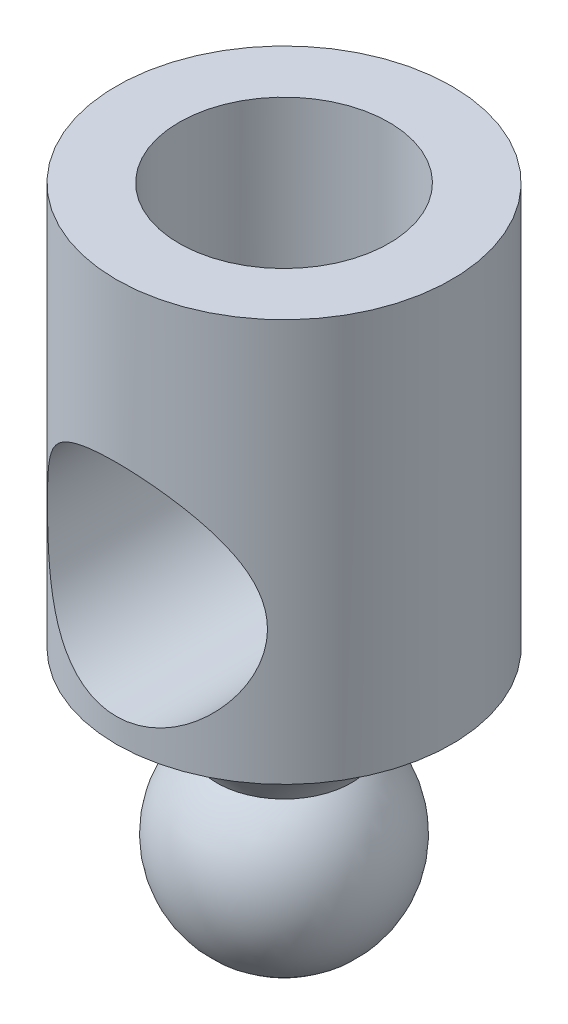
ISO-10303-21;
HEADER;
FILE_DESCRIPTION(('STEP AP214'),'2;1');
FILE_NAME('part.step','',(''),(''),'','','');
FILE_SCHEMA(('AUTOMOTIVE_DESIGN { 1 0 10303 214 1 1 1 1 }'));
ENDSEC;
DATA;
#1=APPLICATION_CONTEXT('core data for automotive mechanical design processes');
#2=APPLICATION_PROTOCOL_DEFINITION('international standard','automotive_design',2000,#1);
#3=PRODUCT_CONTEXT('',#1,'mechanical');
#4=PRODUCT('Part','Part','',(#3));
#5=PRODUCT_RELATED_PRODUCT_CATEGORY('part','',(#4));
#6=PRODUCT_DEFINITION_FORMATION('','',#4);
#7=PRODUCT_DEFINITION_CONTEXT('part definition',#1,'design');
#8=PRODUCT_DEFINITION('design','',#6,#7);
#9=PRODUCT_DEFINITION_SHAPE('','',#8);
#10=(LENGTH_UNIT() NAMED_UNIT(*) SI_UNIT(.MILLI.,.METRE.));
#11=(NAMED_UNIT(*) PLANE_ANGLE_UNIT() SI_UNIT($,.RADIAN.));
#12=(NAMED_UNIT(*) SI_UNIT($,.STERADIAN.) SOLID_ANGLE_UNIT());
#13=UNCERTAINTY_MEASURE_WITH_UNIT(LENGTH_MEASURE(1.E-05),#10,'distance_accuracy_value','');
#14=(GEOMETRIC_REPRESENTATION_CONTEXT(3) GLOBAL_UNCERTAINTY_ASSIGNED_CONTEXT((#13)) GLOBAL_UNIT_ASSIGNED_CONTEXT((#10,
#11,#12)) REPRESENTATION_CONTEXT('',''));
#15=CARTESIAN_POINT('',(0.,0.,0.));
#16=DIRECTION('',(0.,0.,1.));
#17=DIRECTION('',(1.,0.,0.));
#18=AXIS2_PLACEMENT_3D('',#15,#16,#17);
#19=CARTESIAN_POINT('',(0.,19.05,6.35));
#20=DIRECTION('',(0.,0.,-1.));
#21=DIRECTION('',(-1.,0.,0.));
#22=AXIS2_PLACEMENT_3D('',#19,#20,#21);
#23=CYLINDRICAL_SURFACE('',#22,4.1656);
#24=CARTESIAN_POINT('',(-3.97510000000001,20.2953125511292,0.));
#25=CARTESIAN_POINT('',(-3.97509554968441,20.295335517422,-0.0791519670148016));
#26=CARTESIAN_POINT('',(-3.97269911174385,20.3030518927231,-0.158429365302658));
#27=CARTESIAN_POINT('',(-3.9634362281013,20.3320317599681,-0.314261230762067));
#28=CARTESIAN_POINT('',(-3.95655215492789,20.3533486678702,-0.390803699161001));
#29=CARTESIAN_POINT('',(-3.9335422580962,20.4216356934315,-0.586068165336453));
#30=CARTESIAN_POINT('',(-3.91433405819917,20.476317896123,-0.701611718517444));
#31=CARTESIAN_POINT('',(-3.8678301117265,20.5980416781041,-0.924303844677984));
#32=CARTESIAN_POINT('',(-3.84049682348175,20.6651400703834,-1.03141046343628));
#33=CARTESIAN_POINT('',(-3.77306328873875,20.8175773146966,-1.25763625925175));
#34=CARTESIAN_POINT('',(-3.73156431376295,20.9040507211393,-1.37556473436991));
#35=CARTESIAN_POINT('',(-3.63874170014305,21.0802101884166,-1.60508440145081));
#36=CARTESIAN_POINT('',(-3.58740789866918,21.169899493788,-1.71666888180309));
#37=CARTESIAN_POINT('',(-3.47487809033465,21.3497170107396,-1.93433052348862));
#38=CARTESIAN_POINT('',(-3.41368457569766,21.4398451058393,-2.04040906761331));
#39=CARTESIAN_POINT('',(-3.2812249139595,21.6186910047624,-2.24723212284271));
#40=CARTESIAN_POINT('',(-3.20996411591336,21.7074095298634,-2.34797942777272));
#41=CARTESIAN_POINT('',(-3.06729332848414,21.8702885256015,-2.5307500094184));
#42=CARTESIAN_POINT('',(-2.99718781438875,21.9448043833894,-2.61347116507935));
#43=CARTESIAN_POINT('',(-2.84898246634603,22.0907820655723,-2.77429025237044));
#44=CARTESIAN_POINT('',(-2.77088168664025,22.1622435272429,-2.8523876353268));
#45=CARTESIAN_POINT('',(-2.52453973459111,22.3703945656682,-3.07859166655701));
#46=CARTESIAN_POINT('',(-2.34388837985462,22.5012872744491,-3.2190944127581));
#47=CARTESIAN_POINT('',(-1.99957313820616,22.7083303830687,-3.44000436779745));
#48=CARTESIAN_POINT('',(-1.84321466785163,22.7899460811214,-3.52661637287176));
#49=CARTESIAN_POINT('',(-1.59589854389924,22.898826373924,-3.64181523435134));
#50=CARTESIAN_POINT('',(-1.51129965757958,22.9328717168974,-3.67777122714025));
#51=CARTESIAN_POINT('',(-1.33817941647003,22.9958805754372,-3.74423315541814));
#52=CARTESIAN_POINT('',(-1.24965982633125,23.0248463487074,-3.77474151231501));
#53=CARTESIAN_POINT('',(-1.06823243462263,23.0774201941247,-3.83006331298163));
#54=CARTESIAN_POINT('',(-0.975289027911774,23.1009704774091,-3.85481535998253));
#55=CARTESIAN_POINT('',(-0.786582665761275,23.1417994187037,-3.89769959846763));
#56=CARTESIAN_POINT('',(-0.690821277694728,23.1590814944103,-3.91583539744633));
#57=CARTESIAN_POINT('',(-0.497325775056433,23.186959981716,-3.94507972904877));
#58=CARTESIAN_POINT('',(-0.399592901564402,23.1975604717852,-3.95619254854196));
#59=CARTESIAN_POINT('',(-0.203075504425245,23.2118128038177,-3.97113176886082));
#60=CARTESIAN_POINT('',(-0.104291152402012,23.2154657627949,-3.97495934099815));
#61=CARTESIAN_POINT('',(0.0787835082985789,23.2157077956055,-3.97521295189046));
#62=CARTESIAN_POINT('',(0.163073232429158,23.2132549123428,-3.97264282716009));
#63=CARTESIAN_POINT('',(0.331028053252356,23.2032802657629,-3.9621882339517));
#64=CARTESIAN_POINT('',(0.414692951212825,23.1957569538192,-3.95430214185399));
#65=CARTESIAN_POINT('',(0.663744277816944,23.1657651182119,-3.92285136056157));
#66=CARTESIAN_POINT('',(0.827363974163283,23.1358745172631,-3.89149400658756));
#67=CARTESIAN_POINT('',(1.14251689143091,23.0590910665919,-3.81079490668587));
#68=CARTESIAN_POINT('',(1.29421074305759,23.0125027207292,-3.76177517593944));
#69=CARTESIAN_POINT('',(1.58620001776711,22.9049218743675,-3.64827974313377));
#70=CARTESIAN_POINT('',(1.72649199770879,22.8439250443525,-3.5837993953219));
#71=CARTESIAN_POINT('',(2.05708902250343,22.6788987998687,-3.40871306455951));
#72=CARTESIAN_POINT('',(2.24006185300177,22.5680918117728,-3.29064495702532));
#73=CARTESIAN_POINT('',(2.57780363893526,22.3287505754322,-3.03342440256924));
#74=CARTESIAN_POINT('',(2.73248772443709,22.2001649516526,-2.8942107312968));
#75=CARTESIAN_POINT('',(2.96784233547187,21.9759524422894,-2.64802726171746));
#76=CARTESIAN_POINT('',(3.05615232944822,21.8833403195651,-2.54544883435078));
#77=CARTESIAN_POINT('',(3.22072064646752,21.6947760609414,-2.33374635564057));
#78=CARTESIAN_POINT('',(3.2969720219562,21.5988220381751,-2.22461858048333));
#79=CARTESIAN_POINT('',(3.43764673182018,21.4056456908191,-2.00037731169355));
#80=CARTESIAN_POINT('',(3.50208463051244,21.3084250883768,-1.88527141609726));
#81=CARTESIAN_POINT('',(3.61949886364601,21.1149927788909,-1.64866810516243));
#82=CARTESIAN_POINT('',(3.67248392402363,21.018780357275,-1.52717564412753));
#83=CARTESIAN_POINT('',(3.75667877123558,20.8517575215906,-1.30374082655202));
#84=CARTESIAN_POINT('',(3.79011604312019,20.7799994845247,-1.20334585299348));
#85=CARTESIAN_POINT('',(3.84977977142544,20.642783296903,-0.996124985511713));
#86=CARTESIAN_POINT('',(3.8760081106929,20.5773235042648,-0.889300779693336));
#87=CARTESIAN_POINT('',(3.91405101478162,20.476348604399,-0.698691452513253));
#88=CARTESIAN_POINT('',(3.92784266869117,20.4376220902311,-0.617046934783287));
#89=CARTESIAN_POINT('',(3.95060132883655,20.3714392917384,-0.448692498154514));
#90=CARTESIAN_POINT('',(3.95958451570897,20.3439452845962,-0.362000669727867));
#91=CARTESIAN_POINT('',(3.97040807963939,20.3102911072829,-0.204852828007871));
#92=CARTESIAN_POINT('',(3.97341609540265,20.3006785788334,-0.135248598780442));
#93=CARTESIAN_POINT('',(3.9757106630138,20.2933697781969,0.00461994589456567));
#94=CARTESIAN_POINT('',(3.97500096452621,20.2956614994348,0.074883524932912));
#95=CARTESIAN_POINT('',(3.96996432727234,20.3116119315152,0.213571848369096));
#96=CARTESIAN_POINT('',(3.96565359418019,20.325219715636,0.282003415919522));
#97=CARTESIAN_POINT('',(3.95382874256199,20.3614176620368,0.416194000167378));
#98=CARTESIAN_POINT('',(3.94630794645034,20.3840265418009,0.481947131073212));
#99=CARTESIAN_POINT('',(3.92807294573094,20.4368226193649,0.61341368749699));
#100=CARTESIAN_POINT('',(3.91722644497505,20.4673134645011,0.678982932788214));
#101=CARTESIAN_POINT('',(3.89282522369571,20.5330289975351,0.807211187783168));
#102=CARTESIAN_POINT('',(3.87926742059461,20.5682590585581,0.869866783995983));
#103=CARTESIAN_POINT('',(3.83475061769184,20.6788588067278,1.05463814932593));
#104=CARTESIAN_POINT('',(3.80002684672926,20.7588931175626,1.17302741137162));
#105=CARTESIAN_POINT('',(3.71651111921415,20.9342524746542,1.41686654646912));
#106=CARTESIAN_POINT('',(3.66651442689719,21.0302476927119,1.54139502086193));
#107=CARTESIAN_POINT('',(3.55493014927542,21.224223600502,1.78372426009792));
#108=CARTESIAN_POINT('',(3.49333162162094,21.3222060860516,1.90151853569409));
#109=CARTESIAN_POINT('',(3.35843379485028,21.5172246927455,2.13072535332603));
#110=CARTESIAN_POINT('',(3.28515038196089,21.6142619116397,2.24214628474038));
#111=CARTESIAN_POINT('',(3.12651541022343,21.8054594347315,2.45851556544607));
#112=CARTESIAN_POINT('',(3.0411715523947,21.8996215284981,2.56346798416657));
#113=CARTESIAN_POINT('',(2.81424278984539,22.1271680667836,2.81464088943341));
#114=CARTESIAN_POINT('',(2.66522598366777,22.2578835142798,2.95672066463515));
#115=CARTESIAN_POINT('',(2.33896018766756,22.5029733677869,3.22096507980157));
#116=CARTESIAN_POINT('',(2.16176262220362,22.617376832343,3.34316519004067));
#117=CARTESIAN_POINT('',(1.82127619129258,22.800176862334,3.53749235754921));
#118=CARTESIAN_POINT('',(1.66343416799955,22.8731624019056,3.61472488312241));
#119=CARTESIAN_POINT('',(1.41535098107087,22.9687865145644,3.7156693486698));
#120=CARTESIAN_POINT('',(1.3307418058832,22.9983592290148,3.74684082691956));
#121=CARTESIAN_POINT('',(1.1581416102002,23.0523861946528,3.80373129653645));
#122=CARTESIAN_POINT('',(1.07015215109963,23.0768427761832,3.8294527703903));
#123=CARTESIAN_POINT('',(0.890505519786361,23.1203614097743,3.87518883265988));
#124=CARTESIAN_POINT('',(0.798822586126504,23.1393732674792,3.89515033243884));
#125=CARTESIAN_POINT('',(0.613281813242719,23.1712816765694,3.92863655181075));
#126=CARTESIAN_POINT('',(0.519425098692149,23.1841813193055,3.94216452527582));
#127=CARTESIAN_POINT('',(0.330361444698713,23.2035660397777,3.96248871728697));
#128=CARTESIAN_POINT('',(0.23515503351794,23.2100535605008,3.96928749962326));
#129=CARTESIAN_POINT('',(0.0442859573363257,23.2164586849131,3.97599995729229));
#130=CARTESIAN_POINT('',(-0.0513766496461341,23.2163771028849,3.97591448597272));
#131=CARTESIAN_POINT('',(-0.22960257739915,23.2100929124345,3.96932871703515));
#132=CARTESIAN_POINT('',(-0.312227558796566,23.2047000141022,3.96367699389053));
#133=CARTESIAN_POINT('',(-0.476520895970867,23.1890789390396,3.94729993208475));
#134=CARTESIAN_POINT('',(-0.558188933821075,23.1788491995633,3.93657295364709));
#135=CARTESIAN_POINT('',(-0.80084475842499,23.141158547408,3.89702986559826));
#136=CARTESIAN_POINT('',(-0.959641082636773,23.1066901997879,3.86084534848037));
#137=CARTESIAN_POINT('',(-1.26919078010333,23.0208378897686,3.77053682229491));
#138=CARTESIAN_POINT('',(-1.41982834151931,22.9692607718422,3.71620791563258));
#139=CARTESIAN_POINT('',(-1.70889614010694,22.852136548131,3.59246933683454));
#140=CARTESIAN_POINT('',(-1.84732236877762,22.7865848789977,3.52305473836621));
#141=CARTESIAN_POINT('',(-2.17716350469967,22.6084865179294,3.33369590617085));
#142=CARTESIAN_POINT('',(-2.36025655653166,22.4888759761613,3.20588707420158));
#143=CARTESIAN_POINT('',(-2.69626501248465,22.2323387185579,2.92903517488966));
#144=CARTESIAN_POINT('',(-2.84908129554798,22.0953574580864,2.77992502551306));
#145=CARTESIAN_POINT('',(-3.0782600304251,21.8595599343775,2.51888550218268));
#146=CARTESIAN_POINT('',(-3.16295874618506,21.7635875294038,2.41153418922734));
#147=CARTESIAN_POINT('',(-3.32003962930682,21.5689668654093,2.1902493930926));
#148=CARTESIAN_POINT('',(-3.39241315383694,21.4703167844571,2.07631136547295));
#149=CARTESIAN_POINT('',(-3.52502300974049,21.2727393637318,1.84220327337188));
#150=CARTESIAN_POINT('',(-3.58527794141312,21.1738126888348,1.7220431210181));
#151=CARTESIAN_POINT('',(-3.69394888547153,20.9785632109045,1.47460148788043));
#152=CARTESIAN_POINT('',(-3.74237805924598,20.8822376202322,1.3473281194322));
#153=CARTESIAN_POINT('',(-3.81453555756657,20.7253034126796,1.12258365910209));
#154=CARTESIAN_POINT('',(-3.84132217099945,20.6626148961437,1.02755436681667));
#155=CARTESIAN_POINT('',(-3.88855185981177,20.5451079064631,0.831135359017772));
#156=CARTESIAN_POINT('',(-3.90900224677042,20.4902804018026,0.729753138067361));
#157=CARTESIAN_POINT('',(-3.93759252548529,20.4097275759954,0.549946836391392));
#158=CARTESIAN_POINT('',(-3.94758433648424,20.3801887159208,0.473575632634885));
#159=CARTESIAN_POINT('',(-3.96321931515314,20.3328705716138,0.316909148418025));
#160=CARTESIAN_POINT('',(-3.96888105416315,20.3150411137395,0.236632214777426));
#161=CARTESIAN_POINT('',(-3.97307068730353,20.3017749133219,0.129616934982098));
#162=CARTESIAN_POINT('',(-3.97382982783656,20.2993612925087,0.103762908154503));
#163=CARTESIAN_POINT('',(-3.97484524864557,20.2961262344177,0.0519437679074158));
#164=CARTESIAN_POINT('',(-3.97510146064781,20.2953050133121,0.0259786398850908));
#165=CARTESIAN_POINT('',(-3.97510000000001,20.2953125511292,0.));
#166=B_SPLINE_CURVE_WITH_KNOTS('',3,(#24,#25,#26,#27,#28,#29,#30,#31,#32,#33,#34,#35,#36,#37,
#38,#39,#40,#41,#42,#43,#44,#45,#46,#47,#48,#49,#50,#51,#52,#53,#54,#55,#56,#57,#58,#59,#60,#61,
#62,#63,#64,#65,#66,#67,#68,#69,#70,#71,#72,#73,#74,#75,#76,#77,#78,#79,#80,#81,#82,#83,#84,#85,
#86,#87,#88,#89,#90,#91,#92,#93,#94,#95,#96,#97,#98,#99,#100,#101,#102,#103,#104,#105,#106,#107,
#108,#109,#110,#111,#112,#113,#114,#115,#116,#117,#118,#119,#120,#121,#122,#123,#124,#125,#126,
#127,#128,#129,#130,#131,#132,#133,#134,#135,#136,#137,#138,#139,#140,#141,#142,#143,#144,#145,
#146,#147,#148,#149,#150,#151,#152,#153,#154,#155,#156,#157,#158,#159,#160,#161,#162,#163,#164,
#165),.UNSPECIFIED.,.T.,.F.,(4,2,2,2,2,2,2,2,2,2,2,2,2,2,2,2,2,2,2,2,2,2,2,2,2,2,2,2,2,2,2,2,2,
2,2,2,2,2,2,2,2,2,2,2,2,2,2,2,2,2,2,2,2,2,2,2,2,2,2,2,2,2,2,2,2,2,2,2,2,2,4),(0.,
0.23733665845542,0.475611240940753,0.86119398155025,1.24858674270589,1.70396686205978,
2.15982011215679,2.61555831721344,3.07105527905378,3.46539921003325,3.85978984190046,
4.64634390563024,5.2334782910622,5.52724210054817,5.82087500878665,6.11750922676955,
6.41398146301517,6.71027255556353,7.00651600682813,7.25928146546223,7.51212415952786,
8.01728680273782,8.5136703943155,9.01020333127824,9.73918095905546,10.4703109672398,
10.9617516860089,11.4534745240658,11.9445870009452,12.4353239690956,12.8185610340992,
13.2016979089767,13.4753383195757,13.748052039104,13.9580413283474,14.1678188644448,
14.3766573964526,14.5859324888287,14.8049442853016,15.0242065145126,15.464485942024,
15.9588946408362,16.4537720010487,16.9479821975232,17.4418782374145,18.1709076304706,
18.8986216381824,19.4670316932592,19.7514137347499,20.0356659599097,20.322460014306,
20.6091088627611,20.8956484572635,21.1821525333875,21.4308234667618,21.6795747987512,
22.1766122934048,22.6794639297952,23.1824800231237,23.9382335422232,24.6964218083983,
25.1970341049854,25.6979960147641,26.1981830514199,26.6978108451659,27.0483274907447,
27.3984381441878,27.6452401274494,27.8909775663986,27.9688637766775,28.0467605594623),.UNSPECIFIED.);
#167=CARTESIAN_POINT('',(-3.97510000000001,20.2953125511292,0.));
#168=VERTEX_POINT('',#167);
#169=EDGE_CURVE('E91',#168,#168,#166,.T.);
#170=ORIENTED_EDGE('',*,*,#169,.F.);
#171=EDGE_LOOP('',(#170));
#172=FACE_BOUND('',#171,.T.);
#173=CARTESIAN_POINT('',(-4.1656,19.05,-4.79273164698381));
#174=CARTESIAN_POINT('',(-4.16560519295977,19.1522236402507,-4.79272330069813));
#175=CARTESIAN_POINT('',(-4.16183304250097,19.2544100868473,-4.79601248308489));
#176=CARTESIAN_POINT('',(-4.14683829806829,19.4578594529418,-4.808985204295));
#177=CARTESIAN_POINT('',(-4.13561404074865,19.5591221611402,-4.81867017068524));
#178=CARTESIAN_POINT('',(-4.10591359570387,19.7599412844499,-4.84400141666262));
#179=CARTESIAN_POINT('',(-4.08742825466048,19.8594953797126,-4.85965521983016));
#180=CARTESIAN_POINT('',(-4.04353273387588,20.0560945673974,-4.89623907068296));
#181=CARTESIAN_POINT('',(-4.01811905557962,20.1531383650316,-4.91717178362176));
#182=CARTESIAN_POINT('',(-3.93259187487077,20.4377634150707,-4.98623702864617));
#183=CARTESIAN_POINT('',(-3.86286762989173,20.6209511006583,-5.04093278250733));
#184=CARTESIAN_POINT('',(-3.70044144955168,20.9726500865241,-5.16133930537238));
#185=CARTESIAN_POINT('',(-3.60773441153169,21.14115811637,-5.22705251943183));
#186=CARTESIAN_POINT('',(-3.38581809560729,21.4865272192744,-5.37391754504293));
#187=CARTESIAN_POINT('',(-3.25322058088896,21.6608555891628,-5.45590718267377));
#188=CARTESIAN_POINT('',(-2.96206114972648,21.9870418879919,-5.61930265669229));
#189=CARTESIAN_POINT('',(-2.80347510639987,22.1388786847298,-5.70070787652032));
#190=CARTESIAN_POINT('',(-2.53582187253761,22.3571957717898,-5.8226748609776));
#191=CARTESIAN_POINT('',(-2.43480848605525,22.4322920530855,-5.86573930800491));
#192=CARTESIAN_POINT('',(-2.22540818197882,22.5735948600386,-5.94833622179475));
#193=CARTESIAN_POINT('',(-2.11702442486636,22.6398051603174,-5.98787018584638));
#194=CARTESIAN_POINT('',(-1.8934756049838,22.7625768457673,-6.06227045696925));
#195=CARTESIAN_POINT('',(-1.77831426779879,22.8191434665732,-6.09713929454942));
#196=CARTESIAN_POINT('',(-1.54191554321144,22.9218621901707,-6.16116703247238));
#197=CARTESIAN_POINT('',(-1.42067941077546,22.9680164332596,-6.19032710610648));
#198=CARTESIAN_POINT('',(-1.18668106168045,23.0446801366318,-6.23914840061022));
#199=CARTESIAN_POINT('',(-1.0744421059567,23.0763485333388,-6.25949967837905));
#200=CARTESIAN_POINT('',(-0.846843907370399,23.1302878528238,-6.29433081506745));
#201=CARTESIAN_POINT('',(-0.731485254924644,23.1525605407204,-6.30881177679011));
#202=CARTESIAN_POINT('',(-0.498796582848002,23.1872998989103,-6.33145747069362));
#203=CARTESIAN_POINT('',(-0.381468521956611,23.1997757837927,-6.33962813803501));
#204=CARTESIAN_POINT('',(-0.145910046234526,23.214715498735,-6.34941721011991));
#205=CARTESIAN_POINT('',(-0.0276797544056108,23.2171806699675,-6.35103649257686));
#206=CARTESIAN_POINT('',(0.19099666505073,23.212436567748,-6.34792523218097));
#207=CARTESIAN_POINT('',(0.291489137128642,23.2066030304853,-6.34409762662723));
#208=CARTESIAN_POINT('',(0.491532765931882,23.1877185294592,-6.33174067699623));
#209=CARTESIAN_POINT('',(0.591083636707526,23.1746654405502,-6.3232099485111));
#210=CARTESIAN_POINT('',(0.788474837056787,23.1415205274982,-6.3016392950614));
#211=CARTESIAN_POINT('',(0.886315735451421,23.1214310926509,-6.2886009007611));
#212=CARTESIAN_POINT('',(1.07970287044758,23.0744730751006,-6.25830193847363));
#213=CARTESIAN_POINT('',(1.1752482021363,23.0476018655273,-6.24103973450414));
#214=CARTESIAN_POINT('',(1.45708040938612,22.9574165734737,-6.18352687523743));
#215=CARTESIAN_POINT('',(1.63919909203996,22.8844216774868,-6.13747716068117));
#216=CARTESIAN_POINT('',(1.98853367162457,22.7154748868568,-6.03337141464293));
#217=CARTESIAN_POINT('',(2.15574668725294,22.6195185668643,-5.97531306903344));
#218=CARTESIAN_POINT('',(2.49395533187625,22.3934965575714,-5.84292510250288));
#219=CARTESIAN_POINT('',(2.66262490806741,22.2606201888105,-5.76746164469024));
#220=CARTESIAN_POINT('',(2.97679295521017,21.9717414956162,-5.61177234729691));
#221=CARTESIAN_POINT('',(3.12225524395166,21.8157037777116,-5.53153933374824));
#222=CARTESIAN_POINT('',(3.33149952652935,21.5536571687785,-5.40662063461528));
#223=CARTESIAN_POINT('',(3.40371942543223,21.4545744615433,-5.36132105224084));
#224=CARTESIAN_POINT('',(3.53950340689895,21.2498310540911,-5.27266487518611));
#225=CARTESIAN_POINT('',(3.60306561935781,21.1441689398479,-5.2293087016448));
#226=CARTESIAN_POINT('',(3.77985502176229,20.8180131401797,-5.10449946054135));
#227=CARTESIAN_POINT('',(3.87961032057262,20.5878209449581,-5.02803882162413));
#228=CARTESIAN_POINT('',(4.01520513696352,20.1740938173287,-4.91995708312593));
#229=CARTESIAN_POINT('',(4.06112010674636,19.9955403764063,-4.88177546457606));
#230=CARTESIAN_POINT('',(4.12902167179453,19.6310478125759,-4.82448939347142));
#231=CARTESIAN_POINT('',(4.15104747077085,19.4451213108111,-4.80535368957224));
#232=CARTESIAN_POINT('',(4.16978916760215,19.0702959181587,-4.7891071026814));
#233=CARTESIAN_POINT('',(4.16641016717747,18.8813885154767,-4.79207880027937));
#234=CARTESIAN_POINT('',(4.13436758644915,18.5072872211919,-4.81974145449443));
#235=CARTESIAN_POINT('',(4.10568303943984,18.3220965392067,-4.84445042130231));
#236=CARTESIAN_POINT('',(4.02647920901606,17.9676881399344,-4.91044306218956));
#237=CARTESIAN_POINT('',(3.97687283777686,17.7981281279203,-4.95102911284259));
#238=CARTESIAN_POINT('',(3.85810479192324,17.4695549751481,-5.0441259901296));
#239=CARTESIAN_POINT('',(3.78893665964371,17.3105453386823,-5.09664075350285));
#240=CARTESIAN_POINT('',(3.61728410350273,16.9739656076979,-5.22025056898706));
#241=CARTESIAN_POINT('',(3.51091164950647,16.7989775610935,-5.29296455962961));
#242=CARTESIAN_POINT('',(3.2746748416333,16.4673168700628,-5.44229585036068));
#243=CARTESIAN_POINT('',(3.14478196625708,16.3106668467774,-5.51891780741957));
#244=CARTESIAN_POINT('',(2.83435790901558,15.9875678991124,-5.68558704817482));
#245=CARTESIAN_POINT('',(2.64889965347782,15.8255786556015,-5.77520430583642));
#246=CARTESIAN_POINT('',(2.2487783582863,15.5348632093263,-5.94242132078953));
#247=CARTESIAN_POINT('',(2.03414422493739,15.4061044445801,-6.0200328122146));
#248=CARTESIAN_POINT('',(1.62463621402465,15.2089329508507,-6.14160633856501));
#249=CARTESIAN_POINT('',(1.43415392808607,15.1336358628853,-6.18918309896621));
#250=CARTESIAN_POINT('',(1.04100398866095,15.0113351071516,-6.26728483781791));
#251=CARTESIAN_POINT('',(0.838346627735596,14.9643079007359,-6.29782400093268));
#252=CARTESIAN_POINT('',(0.425425096448405,14.900901575437,-6.33914088270123));
#253=CARTESIAN_POINT('',(0.215134112282407,14.8846438830051,-6.34984030397105));
#254=CARTESIAN_POINT('',(-0.205511273340448,14.8841616743275,-6.35015605042496));
#255=CARTESIAN_POINT('',(-0.41586567352165,14.8999365517856,-6.3397727746516));
#256=CARTESIAN_POINT('',(-0.816504588910941,14.9605046487596,-6.30029964298156));
#257=CARTESIAN_POINT('',(-1.00721135405671,15.0033733212917,-6.27245131925309));
#258=CARTESIAN_POINT('',(-1.37813896017802,15.1142086661148,-6.20152574859852));
#259=CARTESIAN_POINT('',(-1.55835813824493,15.1821793060825,-6.15844609421801));
#260=CARTESIAN_POINT('',(-1.91636334606476,15.3458088721909,-6.0569725270951));
#261=CARTESIAN_POINT('',(-2.09321531813054,15.4429908521636,-5.99775979582235));
#262=CARTESIAN_POINT('',(-2.42879168054448,15.6598421342226,-5.86990437119591));
#263=CARTESIAN_POINT('',(-2.58750371495763,15.7795266187347,-5.80125531962122));
#264=CARTESIAN_POINT('',(-2.90845841813137,16.0591434430875,-5.64798286917621));
#265=CARTESIAN_POINT('',(-3.06737882191926,16.2224424714817,-5.56253937626748));
#266=CARTESIAN_POINT('',(-3.35695009612549,16.5731356542856,-5.39273323375114));
#267=CARTESIAN_POINT('',(-3.48758437744554,16.7605438459681,-5.30837124555471));
#268=CARTESIAN_POINT('',(-3.7058513540477,17.1366056296783,-5.15798892030024));
#269=CARTESIAN_POINT('',(-3.79655605880406,17.3230698606752,-5.0909729206625));
#270=CARTESIAN_POINT('',(-3.95024107791134,17.7116359484024,-4.97268117973925));
#271=CARTESIAN_POINT('',(-4.01328344594001,17.9137015962753,-4.92137028697642));
#272=CARTESIAN_POINT('',(-4.09522534811544,18.2720347849314,-4.85320797920771));
#273=CARTESIAN_POINT('',(-4.12150414245693,18.4255630178363,-4.83075561991478));
#274=CARTESIAN_POINT('',(-4.15668408051372,18.7360909675577,-4.8005267328194));
#275=CARTESIAN_POINT('',(-4.16559202893825,18.8930893006419,-4.792744458321));
#276=CARTESIAN_POINT('',(-4.1656,19.05,-4.79273164698381));
#277=B_SPLINE_CURVE_WITH_KNOTS('',3,(#173,#174,#175,#176,#177,#178,#179,#180,#181,#182,#183,
#184,#185,#186,#187,#188,#189,#190,#191,#192,#193,#194,#195,#196,#197,#198,#199,#200,#201,#202,
#203,#204,#205,#206,#207,#208,#209,#210,#211,#212,#213,#214,#215,#216,#217,#218,#219,#220,#221,
#222,#223,#224,#225,#226,#227,#228,#229,#230,#231,#232,#233,#234,#235,#236,#237,#238,#239,#240,
#241,#242,#243,#244,#245,#246,#247,#248,#249,#250,#251,#252,#253,#254,#255,#256,#257,#258,#259,
#260,#261,#262,#263,#264,#265,#266,#267,#268,#269,#270,#271,#272,#273,#274,#275,#276),
.UNSPECIFIED.,.T.,.F.,(4,2,2,2,2,2,2,2,2,2,2,2,2,2,2,2,2,2,2,2,2,2,2,2,2,2,2,2,2,2,2,2,2,2,2,2,
2,2,2,2,2,2,2,2,2,2,2,2,2,2,2,4),(0.,0.30648620726062,0.61304084671156,0.919983175403909,
1.22708078667374,1.83488554545312,2.44282537059855,3.14187298459861,3.84157328626755,
4.24020640800474,4.63866965721116,5.03691588366112,5.43508017459787,5.78970052242094,
6.14425422002558,6.49847403391222,6.85264639007895,7.15448376966228,7.45641004535463,
7.75823389673318,8.06017483726253,8.66213259930582,9.26420647008918,9.94442686184425,
10.6256976266077,11.0173943198696,11.4091754879163,12.1905767004665,12.753200233504,
13.3148990605012,13.8786971232633,14.442962755522,14.9848068308103,15.5268299871161,
16.1764564316175,16.8268759714119,17.6092516698511,18.3908577956632,19.0190360363395,
19.6466905032969,20.2768167745586,20.9069311192223,21.4966621320479,22.0864863990832,
22.7149781415895,23.3438954587498,24.0710691064284,24.7986680749141,25.4500051312623,
26.099873508079,26.5705064744904,27.0409550420325),.UNSPECIFIED.);
#278=CARTESIAN_POINT('',(-4.1656,19.05,-4.79273164698381));
#279=VERTEX_POINT('',#278);
#280=EDGE_CURVE('E55',#279,#279,#277,.T.);
#281=ORIENTED_EDGE('',*,*,#280,.T.);
#282=EDGE_LOOP('',(#281));
#283=FACE_BOUND('',#282,.T.);
#284=CARTESIAN_POINT('',(0.,23.2156,6.35));
#285=CARTESIAN_POINT('',(-0.104999596127576,23.2156055683486,6.35000523635457));
#286=CARTESIAN_POINT('',(-0.209955652862171,23.2116280190298,6.34739265590852));
#287=CARTESIAN_POINT('',(-0.419043904618844,23.1957935420884,6.33702138468666));
#288=CARTESIAN_POINT('',(-0.523176024113033,23.1839359003977,6.32926222754513));
#289=CARTESIAN_POINT('',(-0.729808967368957,23.1525027753964,6.30877672752581));
#290=CARTESIAN_POINT('',(-0.83230915435515,23.1329243526968,6.29604849288231));
#291=CARTESIAN_POINT('',(-1.03492270094492,23.0863329195343,6.26593563452222));
#292=CARTESIAN_POINT('',(-1.13503505989875,23.0593168497105,6.24854909476308));
#293=CARTESIAN_POINT('',(-1.42975664749359,22.9679191949571,6.19016446249119));
#294=CARTESIAN_POINT('',(-1.6199642284283,22.8929983322882,6.1428141323305));
#295=CARTESIAN_POINT('',(-1.98426778118903,22.718220283155,6.03501455970547));
#296=CARTESIAN_POINT('',(-2.15836182722568,22.6183601213617,5.9745637544313));
#297=CARTESIAN_POINT('',(-2.50206418336573,22.3874055108904,5.83943833450246));
#298=CARTESIAN_POINT('',(-2.67007936681144,22.2543971964013,5.76399692834109));
#299=CARTESIAN_POINT('',(-2.98298572936495,21.9653861857521,5.60846345292425));
#300=CARTESIAN_POINT('',(-3.12784382615141,21.8093511944623,5.52836494924601));
#301=CARTESIAN_POINT('',(-3.3363904055532,21.5471403012896,5.40360225501319));
#302=CARTESIAN_POINT('',(-3.40847098758773,21.4478394675361,5.35829951394179));
#303=CARTESIAN_POINT('',(-3.54395505683499,21.2426578419922,5.26967169889385));
#304=CARTESIAN_POINT('',(-3.60735666405877,21.1367756317821,5.22634705475141));
#305=CARTESIAN_POINT('',(-3.78362866766071,20.8099540197825,5.10169350163273));
#306=CARTESIAN_POINT('',(-3.88298941676373,20.5793112622804,5.02541889244464));
#307=CARTESIAN_POINT('',(-4.01768936745971,20.1651605825491,4.91792094185178));
#308=CARTESIAN_POINT('',(-4.06317505427189,19.986640347732,4.88006036806001));
#309=CARTESIAN_POINT('',(-4.13023617154393,19.6223017772214,4.82344478892428));
#310=CARTESIAN_POINT('',(-4.1518508312617,19.4364959366122,4.80465844141769));
#311=CARTESIAN_POINT('',(-4.1698121510995,19.062025119854,4.78908563733798));
#312=CARTESIAN_POINT('',(-4.1660662728506,18.873352181946,4.79237974998428));
#313=CARTESIAN_POINT('',(-4.13336560689431,18.4997888229345,4.82060263825977));
#314=CARTESIAN_POINT('',(-4.10438959198897,18.3149017211153,4.84554963133131));
#315=CARTESIAN_POINT('',(-4.0246278252951,17.9608137943311,4.91196464952372));
#316=CARTESIAN_POINT('',(-3.97471436945419,17.7912837540451,4.95276755989148));
#317=CARTESIAN_POINT('',(-3.85533680672186,17.4628082992786,5.0462473200355));
#318=CARTESIAN_POINT('',(-3.78586628005917,17.3038663816593,5.09892806767828));
#319=CARTESIAN_POINT('',(-3.61345936114098,16.9672882033451,5.22290991343275));
#320=CARTESIAN_POINT('',(-3.5066104518746,16.7922563179485,5.29582863564287));
#321=CARTESIAN_POINT('',(-3.26937066103081,16.4605822949097,5.44549716977107));
#322=CARTESIAN_POINT('',(-3.13895108693959,16.3039629586326,5.52225156753708));
#323=CARTESIAN_POINT('',(-2.82746587958349,15.9811897054809,5.68903324111487));
#324=CARTESIAN_POINT('',(-2.64149097719852,15.8194897032737,5.77861331369674));
#325=CARTESIAN_POINT('',(-2.24034034726982,15.5294646967454,5.94562325682302));
#326=CARTESIAN_POINT('',(-2.02519405975753,15.4011064196342,6.02306520953689));
#327=CARTESIAN_POINT('',(-1.61510010184567,15.2049203894813,6.14412158952533));
#328=CARTESIAN_POINT('',(-1.42456061364872,15.1301438209891,6.19139650015941));
#329=CARTESIAN_POINT('',(-1.03139600993825,15.0088781835997,6.26887144383878));
#330=CARTESIAN_POINT('',(-0.828781093826642,14.9623656034174,6.29908566726322));
#331=CARTESIAN_POINT('',(-0.416063603301932,14.8999614477471,6.33975771783478));
#332=CARTESIAN_POINT('',(-0.205934953921821,14.884189765003,6.35013818816222));
#333=CARTESIAN_POINT('',(0.214286665332012,14.8846144211141,6.3498590657488));
#334=CARTESIAN_POINT('',(0.424379635615133,14.9008103643213,6.33919973340757));
#335=CARTESIAN_POINT('',(0.82463007875396,14.9621370557789,6.29923912559978));
#336=CARTESIAN_POINT('',(1.01520833983971,15.0053745580778,6.27115851673037));
#337=CARTESIAN_POINT('',(1.38582437981263,15.1169105229258,6.19980944452008));
#338=CARTESIAN_POINT('',(1.56586045392125,15.1852130258333,6.15653853262375));
#339=CARTESIAN_POINT('',(1.92361444944128,15.3495624724194,6.054673944896));
#340=CARTESIAN_POINT('',(2.10038198669986,15.4471524150505,5.99525263729558));
#341=CARTESIAN_POINT('',(2.43573320376017,15.6648183568022,5.8670261933533));
#342=CARTESIAN_POINT('',(2.59430430891432,15.7849097564606,5.798214638917));
#343=CARTESIAN_POINT('',(2.91493798954474,16.0654417799139,5.64463927194445));
#344=CARTESIAN_POINT('',(3.07366336459712,16.2292557398695,5.55906426293956));
#345=CARTESIAN_POINT('',(3.36274444365963,16.5809854761935,5.38911615799394));
#346=CARTESIAN_POINT('',(3.49308563733696,16.7689135023133,5.30474369731025));
#347=CARTESIAN_POINT('',(3.71035264402043,17.1453983520686,5.15473524289541));
#348=CARTESIAN_POINT('',(3.80044354635847,17.3317046232451,5.08805995172511));
#349=CARTESIAN_POINT('',(3.9530125300023,17.7198838423773,4.97046472414317));
#350=CARTESIAN_POINT('',(4.01554047717249,17.9217278960685,4.91951638560877));
#351=CARTESIAN_POINT('',(4.10206832176768,18.3035721485447,4.84749499900848));
#352=CARTESIAN_POINT('',(4.13064958711375,18.4818592276757,4.82293329170412));
#353=CARTESIAN_POINT('',(4.16433780726544,18.8422041226469,4.79388447980423));
#354=CARTESIAN_POINT('',(4.1694655024324,19.0242584638427,4.78937963869994));
#355=CARTESIAN_POINT('',(4.15592877819247,19.3867134083843,4.80112660879519));
#356=CARTESIAN_POINT('',(4.13727110534182,19.5671144660567,4.81737253418488));
#357=CARTESIAN_POINT('',(4.07738139536323,19.9215460232954,4.86815709315291));
#358=CARTESIAN_POINT('',(4.03611983134576,20.0955678719483,4.90271965135416));
#359=CARTESIAN_POINT('',(3.91834461236154,20.4819152126863,4.99762517654125));
#360=CARTESIAN_POINT('',(3.83514483802984,20.6910701126911,5.06250341184227));
#361=CARTESIAN_POINT('',(3.63877837308448,21.089876188531,5.20543073888517));
#362=CARTESIAN_POINT('',(3.52557030962941,21.2794999314171,5.28349796015748));
#363=CARTESIAN_POINT('',(3.26989362277747,21.6403109005992,5.44551304879416));
#364=CARTESIAN_POINT('',(3.12697214953071,21.811141455812,5.52953680576932));
#365=CARTESIAN_POINT('',(2.81481394737311,22.1287276680488,5.69477510863096));
#366=CARTESIAN_POINT('',(2.64557011189162,22.2754768014629,5.77598888861363));
#367=CARTESIAN_POINT('',(2.36311221375703,22.4827385896932,5.89493934696735));
#368=CARTESIAN_POINT('',(2.25814354423192,22.5527231571824,5.93604286369564));
#369=CARTESIAN_POINT('',(2.04116559174149,22.6834406866618,6.01410110924753));
#370=CARTESIAN_POINT('',(1.92915979321483,22.7441781771353,6.05105786647708));
#371=CARTESIAN_POINT('',(1.69887984736998,22.8555699419776,6.11969923420882));
#372=CARTESIAN_POINT('',(1.58061430290244,22.9062376220363,6.1513908447179));
#373=CARTESIAN_POINT('',(1.33863149789282,22.996768041851,6.2085445899061));
#374=CARTESIAN_POINT('',(1.21491665671557,23.0366355215429,6.23400945686683));
#375=CARTESIAN_POINT('',(0.913355665395232,23.1182989718342,6.28649198772982));
#376=CARTESIAN_POINT('',(0.733401018342391,23.1546562185133,6.31016231109618));
#377=CARTESIAN_POINT('',(0.368918156291028,23.2032966704627,6.34190836859891));
#378=CARTESIAN_POINT('',(0.184391941290956,23.215590221309,6.34999080433049));
#379=CARTESIAN_POINT('',(0.,23.2156,6.35));
#380=B_SPLINE_CURVE_WITH_KNOTS('',3,(#284,#285,#286,#287,#288,#289,#290,#291,#292,#293,#294,
#295,#296,#297,#298,#299,#300,#301,#302,#303,#304,#305,#306,#307,#308,#309,#310,#311,#312,#313,
#314,#315,#316,#317,#318,#319,#320,#321,#322,#323,#324,#325,#326,#327,#328,#329,#330,#331,#332,
#333,#334,#335,#336,#337,#338,#339,#340,#341,#342,#343,#344,#345,#346,#347,#348,#349,#350,#351,
#352,#353,#354,#355,#356,#357,#358,#359,#360,#361,#362,#363,#364,#365,#366,#367,#368,#369,#370,
#371,#372,#373,#374,#375,#376,#377,#378,#379),.UNSPECIFIED.,.T.,.F.,(4,2,2,2,2,2,2,2,2,2,2,2,2,
2,2,2,2,2,2,2,2,2,2,2,2,2,2,2,2,2,2,2,2,2,2,2,2,2,2,2,2,2,2,2,2,2,2,4),(0.,0.314816141679005,
0.629660814851214,0.944625468864444,1.25971987277654,1.88625093554399,2.51285678097567,
3.19187266198679,3.87185008275297,4.26381439205921,4.65586347248839,5.43780664562247,
5.99982681192214,6.5609219826501,7.12406564086027,7.68768355433414,8.22984444924824,
8.77218352092356,9.42281580850508,10.0742455101741,10.8571330728623,11.639236338796,
12.2668095287652,12.893859957295,13.523351093508,14.1528344388576,14.7425369604781,
15.3323345811122,15.9613551464037,16.5908078115712,17.3187678049925,18.0470990711785,
18.6969359383631,19.3455922710051,19.8898452979333,20.43361694017,20.977234379627,
21.5215636319051,22.220598491218,22.9206021780984,23.6321798301116,24.3439499300226,
24.7415257428194,25.1389062239262,25.5357540853813,25.9324274970994,26.4855204119084,
27.0383754861642),.UNSPECIFIED.);
#381=CARTESIAN_POINT('',(0.,23.2156,6.35));
#382=VERTEX_POINT('',#381);
#383=EDGE_CURVE('E12',#382,#382,#380,.T.);
#384=ORIENTED_EDGE('',*,*,#383,.T.);
#385=EDGE_LOOP('',(#384));
#386=FACE_BOUND('',#385,.T.);
#387=ADVANCED_FACE('F43',(#172,#283,#386),#23,.F.);
#388=CARTESIAN_POINT('',(0.,-7.98356504178646,0.));
#389=DIRECTION('',(0.,1.,0.));
#390=DIRECTION('',(0.,0.,1.));
#391=AXIS2_PLACEMENT_3D('',#388,#389,#390);
#392=CYLINDRICAL_SURFACE('',#391,6.35000000000001);
#393=ORIENTED_EDGE('',*,*,#383,.F.);
#394=EDGE_LOOP('',(#393));
#395=FACE_BOUND('',#394,.T.);
#396=CARTESIAN_POINT('',(0.,29.21,0.));
#397=DIRECTION('',(0.,1.,0.));
#398=DIRECTION('',(0.,0.,1.));
#399=AXIS2_PLACEMENT_3D('',#396,#397,#398);
#400=CIRCLE('',#399,6.35000000000001);
#401=CARTESIAN_POINT('',(0.,29.21,6.35000000000001));
#402=VERTEX_POINT('',#401);
#403=EDGE_CURVE('E60',#402,#402,#400,.T.);
#404=ORIENTED_EDGE('',*,*,#403,.F.);
#405=EDGE_LOOP('',(#404));
#406=FACE_BOUND('',#405,.T.);
#407=ORIENTED_EDGE('',*,*,#280,.F.);
#408=EDGE_LOOP('',(#407));
#409=FACE_BOUND('',#408,.T.);
#410=CARTESIAN_POINT('',(0.,13.97,0.));
#411=DIRECTION('',(0.,1.,0.));
#412=DIRECTION('',(-1.,0.,0.));
#413=AXIS2_PLACEMENT_3D('',#410,#411,#412);
#414=CIRCLE('',#413,6.35000000000001);
#415=CARTESIAN_POINT('',(-6.35000000000001,13.97,0.));
#416=VERTEX_POINT('',#415);
#417=EDGE_CURVE('E65',#416,#416,#414,.T.);
#418=ORIENTED_EDGE('',*,*,#417,.T.);
#419=EDGE_LOOP('',(#418));
#420=FACE_BOUND('',#419,.T.);
#421=ADVANCED_FACE('F72',(#395,#406,#409,#420),#392,.T.);
#422=CARTESIAN_POINT('',(6.34999999999999,29.21,6.35));
#423=DIRECTION('',(0.,-1.,0.));
#424=DIRECTION('',(1.,0.,0.));
#425=AXIS2_PLACEMENT_3D('',#422,#423,#424);
#426=PLANE('',#425);
#427=CARTESIAN_POINT('',(0.,29.21,0.));
#428=DIRECTION('',(0.,1.,0.));
#429=DIRECTION('',(-1.,0.,0.));
#430=AXIS2_PLACEMENT_3D('',#427,#428,#429);
#431=CIRCLE('',#430,3.9751);
#432=CARTESIAN_POINT('',(-3.97510000000002,29.21,0.));
#433=VERTEX_POINT('',#432);
#434=EDGE_CURVE('E100',#433,#433,#431,.T.);
#435=ORIENTED_EDGE('',*,*,#434,.F.);
#436=EDGE_LOOP('',(#435));
#437=FACE_BOUND('',#436,.T.);
#438=ORIENTED_EDGE('',*,*,#403,.T.);
#439=EDGE_LOOP('',(#438));
#440=FACE_BOUND('',#439,.T.);
#441=ADVANCED_FACE('F45',(#437,#440),#426,.F.);
#442=CARTESIAN_POINT('',(0.,7.36600658850816,0.));
#443=DIRECTION('',(0.,1.,0.));
#444=DIRECTION('',(-1.,0.,0.));
#445=AXIS2_PLACEMENT_3D('',#442,#443,#444);
#446=TOROIDAL_SURFACE('',#445,8.6254111762432,6.985);
#447=ORIENTED_EDGE('',*,*,#417,.F.);
#448=EDGE_LOOP('',(#447));
#449=FACE_BOUND('',#448,.T.);
#450=CARTESIAN_POINT('',(0.,10.795,0.));
#451=DIRECTION('',(0.,1.,0.));
#452=DIRECTION('',(-1.,0.,0.));
#453=AXIS2_PLACEMENT_3D('',#450,#451,#452);
#454=CIRCLE('',#453,2.54);
#455=CARTESIAN_POINT('',(-2.54,10.795,0.));
#456=VERTEX_POINT('',#455);
#457=EDGE_CURVE('E99',#456,#456,#454,.T.);
#458=ORIENTED_EDGE('',*,*,#457,.T.);
#459=EDGE_LOOP('',(#458));
#460=FACE_BOUND('',#459,.T.);
#461=ADVANCED_FACE('F77',(#449,#460),#446,.F.);
#462=CARTESIAN_POINT('',(0.,7.87055094932396,0.));
#463=DIRECTION('',(0.,1.,0.));
#464=DIRECTION('',(-1.,0.,0.));
#465=AXIS2_PLACEMENT_3D('',#462,#463,#464);
#466=SPHERICAL_SURFACE('',#465,3.8735);
#467=ORIENTED_EDGE('',*,*,#457,.F.);
#468=EDGE_LOOP('',(#467));
#469=FACE_BOUND('',#468,.T.);
#470=ADVANCED_FACE('F81',(#469),#466,.T.);
#471=CARTESIAN_POINT('',(0.,19.05,0.));
#472=DIRECTION('',(0.,1.,0.));
#473=DIRECTION('',(-1.,0.,0.));
#474=AXIS2_PLACEMENT_3D('',#471,#472,#473);
#475=CYLINDRICAL_SURFACE('',#474,3.9751);
#476=ORIENTED_EDGE('',*,*,#169,.T.);
#477=EDGE_LOOP('',(#476));
#478=FACE_BOUND('',#477,.T.);
#479=ORIENTED_EDGE('',*,*,#434,.T.);
#480=EDGE_LOOP('',(#479));
#481=FACE_BOUND('',#480,.T.);
#482=ADVANCED_FACE('F85',(#478,#481),#475,.F.);
#483=CLOSED_SHELL('',(#387,#421,#441,#461,#470,#482));
#484=MANIFOLD_SOLID_BREP('B2',#483);
#485=ADVANCED_BREP_SHAPE_REPRESENTATION('',(#18,#484),#14);
#486=SHAPE_DEFINITION_REPRESENTATION(#9,#485);
ENDSEC;
END-ISO-10303-21;
